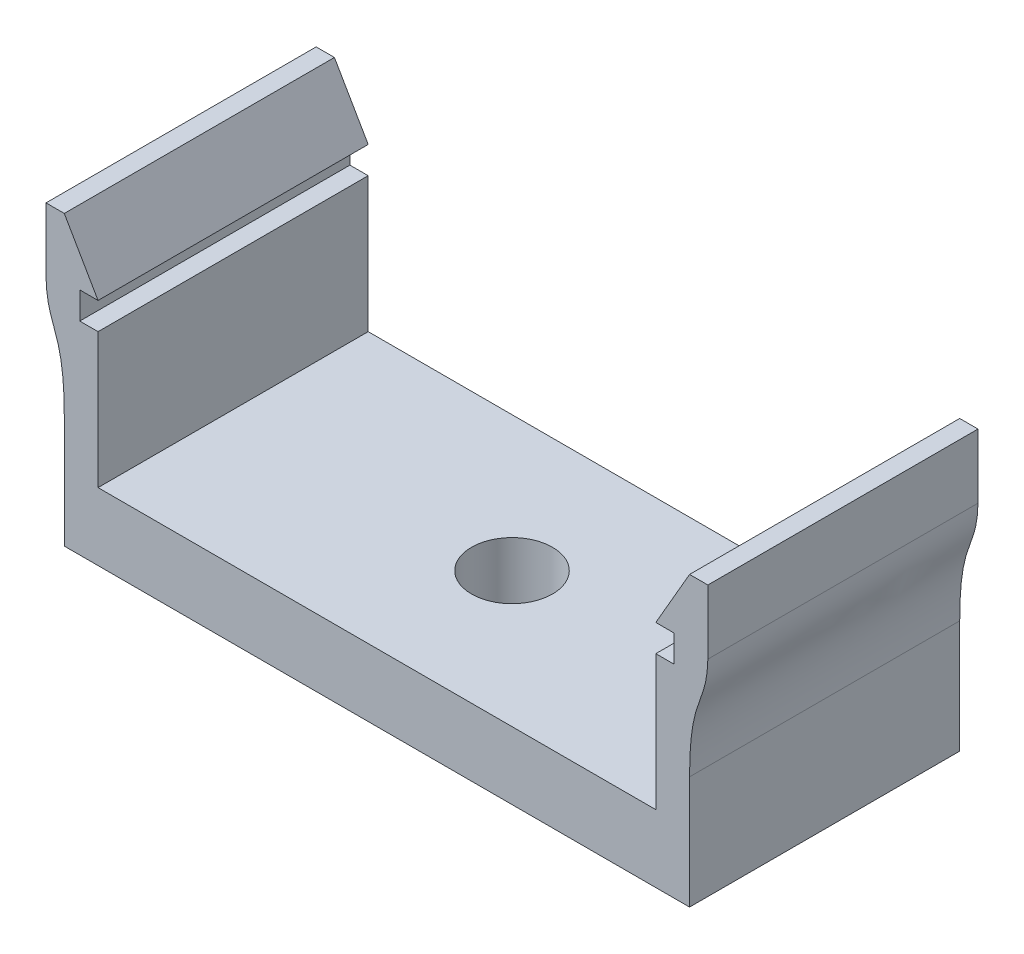
ISO-10303-21;
HEADER;
FILE_DESCRIPTION(('STEP AP214'),'2;1');
FILE_NAME('part.step','',(''),(''),'','','');
FILE_SCHEMA(('AUTOMOTIVE_DESIGN { 1 0 10303 214 1 1 1 1 }'));
ENDSEC;
DATA;
#1=APPLICATION_CONTEXT('core data for automotive mechanical design processes');
#2=APPLICATION_PROTOCOL_DEFINITION('international standard','automotive_design',2000,#1);
#3=PRODUCT_CONTEXT('',#1,'mechanical');
#4=PRODUCT('Part','Part','',(#3));
#5=PRODUCT_RELATED_PRODUCT_CATEGORY('part','',(#4));
#6=PRODUCT_DEFINITION_FORMATION('','',#4);
#7=PRODUCT_DEFINITION_CONTEXT('part definition',#1,'design');
#8=PRODUCT_DEFINITION('design','',#6,#7);
#9=PRODUCT_DEFINITION_SHAPE('','',#8);
#10=(LENGTH_UNIT() NAMED_UNIT(*) SI_UNIT(.MILLI.,.METRE.));
#11=(NAMED_UNIT(*) PLANE_ANGLE_UNIT() SI_UNIT($,.RADIAN.));
#12=(NAMED_UNIT(*) SI_UNIT($,.STERADIAN.) SOLID_ANGLE_UNIT());
#13=UNCERTAINTY_MEASURE_WITH_UNIT(LENGTH_MEASURE(1.E-05),#10,'distance_accuracy_value','');
#14=(GEOMETRIC_REPRESENTATION_CONTEXT(3) GLOBAL_UNCERTAINTY_ASSIGNED_CONTEXT((#13)) GLOBAL_UNIT_ASSIGNED_CONTEXT((#10,
#11,#12)) REPRESENTATION_CONTEXT('',''));
#15=CARTESIAN_POINT('',(0.,0.,0.));
#16=DIRECTION('',(0.,0.,1.));
#17=DIRECTION('',(1.,0.,0.));
#18=AXIS2_PLACEMENT_3D('',#15,#16,#17);
#19=CARTESIAN_POINT('',(-14.6977804438465,0.,12.7));
#20=DIRECTION('',(0.,1.,0.));
#21=DIRECTION('',(0.,0.,1.));
#22=AXIS2_PLACEMENT_3D('',#19,#20,#21);
#23=PLANE('',#22);
#24=CARTESIAN_POINT('',(0.,0.,6.35));
#25=DIRECTION('',(0.,1.,0.));
#26=DIRECTION('',(0.,0.,1.));
#27=AXIS2_PLACEMENT_3D('',#24,#25,#26);
#28=CIRCLE('',#27,1.905);
#29=CARTESIAN_POINT('',(0.,0.,8.255));
#30=VERTEX_POINT('',#29);
#31=EDGE_CURVE('E313',#30,#30,#28,.T.);
#32=ORIENTED_EDGE('',*,*,#31,.T.);
#33=EDGE_LOOP('',(#32));
#34=FACE_BOUND('',#33,.T.);
#35=DIRECTION('',(1.,0.,0.));
#36=VECTOR('',#35,1.);
#37=CARTESIAN_POINT('',(-14.6977804438465,0.,0.));
#38=LINE('',#37,#36);
#39=CARTESIAN_POINT('',(-14.6977804438465,0.,0.));
#40=VERTEX_POINT('',#39);
#41=CARTESIAN_POINT('',(14.6977804438465,0.,0.));
#42=VERTEX_POINT('',#41);
#43=EDGE_CURVE('E213',#40,#42,#38,.T.);
#44=ORIENTED_EDGE('',*,*,#43,.T.);
#45=DIRECTION('',(0.,0.,-1.));
#46=VECTOR('',#45,1.);
#47=CARTESIAN_POINT('',(14.6977804438465,0.,12.7));
#48=LINE('',#47,#46);
#49=CARTESIAN_POINT('',(14.6977804438465,0.,12.7));
#50=VERTEX_POINT('',#49);
#51=EDGE_CURVE('E285',#50,#42,#48,.T.);
#52=ORIENTED_EDGE('',*,*,#51,.F.);
#53=DIRECTION('',(1.,0.,0.));
#54=VECTOR('',#53,1.);
#55=CARTESIAN_POINT('',(-14.6977804438465,0.,12.7));
#56=LINE('',#55,#54);
#57=CARTESIAN_POINT('',(-14.6977804438465,0.,12.7));
#58=VERTEX_POINT('',#57);
#59=EDGE_CURVE('E242',#58,#50,#56,.T.);
#60=ORIENTED_EDGE('',*,*,#59,.F.);
#61=DIRECTION('',(0.,0.,-1.));
#62=VECTOR('',#61,1.);
#63=CARTESIAN_POINT('',(-14.6977804438465,0.,12.7));
#64=LINE('',#63,#62);
#65=EDGE_CURVE('E150',#58,#40,#64,.T.);
#66=ORIENTED_EDGE('',*,*,#65,.T.);
#67=EDGE_LOOP('',(#44,#52,#60,#66));
#68=FACE_BOUND('',#67,.T.);
#69=ADVANCED_FACE('F41',(#34,#68),#23,.F.);
#70=CARTESIAN_POINT('',(0.,3.175,12.7));
#71=DIRECTION('',(0.,-1.,0.));
#72=DIRECTION('',(0.,0.,-1.));
#73=AXIS2_PLACEMENT_3D('',#70,#71,#72);
#74=PLANE('',#73);
#75=CARTESIAN_POINT('',(0.,3.175,6.35));
#76=DIRECTION('',(0.,1.,0.));
#77=DIRECTION('',(0.,0.,1.));
#78=AXIS2_PLACEMENT_3D('',#75,#76,#77);
#79=CIRCLE('',#78,1.905);
#80=CARTESIAN_POINT('',(0.,3.175,8.255));
#81=VERTEX_POINT('',#80);
#82=EDGE_CURVE('E201',#81,#81,#79,.T.);
#83=ORIENTED_EDGE('',*,*,#82,.F.);
#84=EDGE_LOOP('',(#83));
#85=FACE_BOUND('',#84,.T.);
#86=DIRECTION('',(-1.,0.,0.));
#87=VECTOR('',#86,1.);
#88=CARTESIAN_POINT('',(0.,3.175,0.));
#89=LINE('',#88,#87);
#90=CARTESIAN_POINT('',(13.1102804438465,3.175,0.));
#91=VERTEX_POINT('',#90);
#92=CARTESIAN_POINT('',(-13.1102804438465,3.175,0.));
#93=VERTEX_POINT('',#92);
#94=EDGE_CURVE('E204',#91,#93,#89,.T.);
#95=ORIENTED_EDGE('',*,*,#94,.T.);
#96=DIRECTION('',(0.,0.,-1.));
#97=VECTOR('',#96,1.);
#98=CARTESIAN_POINT('',(-13.1102804438465,3.175,12.7));
#99=LINE('',#98,#97);
#100=CARTESIAN_POINT('',(-13.1102804438465,3.175,12.7));
#101=VERTEX_POINT('',#100);
#102=EDGE_CURVE('E11',#101,#93,#99,.T.);
#103=ORIENTED_EDGE('',*,*,#102,.F.);
#104=DIRECTION('',(-1.,0.,0.));
#105=VECTOR('',#104,1.);
#106=CARTESIAN_POINT('',(0.,3.175,12.7));
#107=LINE('',#106,#105);
#108=CARTESIAN_POINT('',(13.1102804438465,3.175,12.7));
#109=VERTEX_POINT('',#108);
#110=EDGE_CURVE('E107',#109,#101,#107,.T.);
#111=ORIENTED_EDGE('',*,*,#110,.F.);
#112=DIRECTION('',(0.,0.,-1.));
#113=VECTOR('',#112,1.);
#114=CARTESIAN_POINT('',(13.1102804438465,3.175,12.7));
#115=LINE('',#114,#113);
#116=EDGE_CURVE('E207',#109,#91,#115,.T.);
#117=ORIENTED_EDGE('',*,*,#116,.T.);
#118=EDGE_LOOP('',(#95,#103,#111,#117));
#119=FACE_BOUND('',#118,.T.);
#120=ADVANCED_FACE('F190',(#85,#119),#74,.F.);
#121=CARTESIAN_POINT('',(-13.1102804438465,3.175,12.7));
#122=DIRECTION('',(-1.,0.,0.));
#123=DIRECTION('',(0.,-1.,0.));
#124=AXIS2_PLACEMENT_3D('',#121,#122,#123);
#125=PLANE('',#124);
#126=DIRECTION('',(0.,1.,0.));
#127=VECTOR('',#126,1.);
#128=CARTESIAN_POINT('',(-13.1102804438465,3.175,0.));
#129=LINE('',#128,#127);
#130=CARTESIAN_POINT('',(-13.1102804438465,9.525,0.));
#131=VERTEX_POINT('',#130);
#132=EDGE_CURVE('E212',#93,#131,#129,.T.);
#133=ORIENTED_EDGE('',*,*,#132,.T.);
#134=DIRECTION('',(0.,0.,-1.));
#135=VECTOR('',#134,1.);
#136=CARTESIAN_POINT('',(-13.1102804438465,9.525,12.7));
#137=LINE('',#136,#135);
#138=CARTESIAN_POINT('',(-13.1102804438465,9.525,12.7));
#139=VERTEX_POINT('',#138);
#140=EDGE_CURVE('E49',#139,#131,#137,.T.);
#141=ORIENTED_EDGE('',*,*,#140,.F.);
#142=DIRECTION('',(0.,1.,0.));
#143=VECTOR('',#142,1.);
#144=CARTESIAN_POINT('',(-13.1102804438465,3.175,12.7));
#145=LINE('',#144,#143);
#146=EDGE_CURVE('E217',#101,#139,#145,.T.);
#147=ORIENTED_EDGE('',*,*,#146,.F.);
#148=ORIENTED_EDGE('',*,*,#102,.T.);
#149=EDGE_LOOP('',(#133,#141,#147,#148));
#150=FACE_BOUND('',#149,.T.);
#151=ADVANCED_FACE('F187',(#150),#125,.F.);
#152=CARTESIAN_POINT('',(-13.1102804438465,9.525,12.7));
#153=DIRECTION('',(0.,-1.,0.));
#154=DIRECTION('',(0.,0.,-1.));
#155=AXIS2_PLACEMENT_3D('',#152,#153,#154);
#156=PLANE('',#155);
#157=DIRECTION('',(-1.,0.,0.));
#158=VECTOR('',#157,1.);
#159=CARTESIAN_POINT('',(-13.1102804438465,9.525,0.));
#160=LINE('',#159,#158);
#161=CARTESIAN_POINT('',(-13.97,9.525,0.));
#162=VERTEX_POINT('',#161);
#163=EDGE_CURVE('E222',#131,#162,#160,.T.);
#164=ORIENTED_EDGE('',*,*,#163,.T.);
#165=DIRECTION('',(0.,0.,-1.));
#166=VECTOR('',#165,1.);
#167=CARTESIAN_POINT('',(-13.97,9.525,12.7));
#168=LINE('',#167,#166);
#169=CARTESIAN_POINT('',(-13.97,9.525,12.7));
#170=VERTEX_POINT('',#169);
#171=EDGE_CURVE('E255',#170,#162,#168,.T.);
#172=ORIENTED_EDGE('',*,*,#171,.F.);
#173=DIRECTION('',(-1.,0.,0.));
#174=VECTOR('',#173,1.);
#175=CARTESIAN_POINT('',(-13.1102804438465,9.525,12.7));
#176=LINE('',#175,#174);
#177=EDGE_CURVE('E259',#139,#170,#176,.T.);
#178=ORIENTED_EDGE('',*,*,#177,.F.);
#179=ORIENTED_EDGE('',*,*,#140,.T.);
#180=EDGE_LOOP('',(#164,#172,#178,#179));
#181=FACE_BOUND('',#180,.T.);
#182=ADVANCED_FACE('F183',(#181),#156,.F.);
#183=CARTESIAN_POINT('',(-13.97,9.525,12.7));
#184=DIRECTION('',(-1.,0.,0.));
#185=DIRECTION('',(0.,0.,1.));
#186=AXIS2_PLACEMENT_3D('',#183,#184,#185);
#187=PLANE('',#186);
#188=DIRECTION('',(0.,1.,0.));
#189=VECTOR('',#188,1.);
#190=CARTESIAN_POINT('',(-13.97,9.525,0.));
#191=LINE('',#190,#189);
#192=CARTESIAN_POINT('',(-13.97,10.795,0.));
#193=VERTEX_POINT('',#192);
#194=EDGE_CURVE('E224',#162,#193,#191,.T.);
#195=ORIENTED_EDGE('',*,*,#194,.T.);
#196=DIRECTION('',(0.,0.,-1.));
#197=VECTOR('',#196,1.);
#198=CARTESIAN_POINT('',(-13.97,10.795,12.7));
#199=LINE('',#198,#197);
#200=CARTESIAN_POINT('',(-13.97,10.795,12.7));
#201=VERTEX_POINT('',#200);
#202=EDGE_CURVE('E252',#201,#193,#199,.T.);
#203=ORIENTED_EDGE('',*,*,#202,.F.);
#204=DIRECTION('',(0.,1.,0.));
#205=VECTOR('',#204,1.);
#206=CARTESIAN_POINT('',(-13.97,9.525,12.7));
#207=LINE('',#206,#205);
#208=EDGE_CURVE('E261',#170,#201,#207,.T.);
#209=ORIENTED_EDGE('',*,*,#208,.F.);
#210=ORIENTED_EDGE('',*,*,#171,.T.);
#211=EDGE_LOOP('',(#195,#203,#209,#210));
#212=FACE_BOUND('',#211,.T.);
#213=ADVANCED_FACE('F179',(#212),#187,.F.);
#214=CARTESIAN_POINT('',(-13.97,10.795,12.7));
#215=DIRECTION('',(0.,1.,0.));
#216=DIRECTION('',(0.,0.,1.));
#217=AXIS2_PLACEMENT_3D('',#214,#215,#216);
#218=PLANE('',#217);
#219=DIRECTION('',(1.,0.,0.));
#220=VECTOR('',#219,1.);
#221=CARTESIAN_POINT('',(-13.97,10.795,0.));
#222=LINE('',#221,#220);
#223=CARTESIAN_POINT('',(-13.1102804438465,10.795,0.));
#224=VERTEX_POINT('',#223);
#225=EDGE_CURVE('E228',#193,#224,#222,.T.);
#226=ORIENTED_EDGE('',*,*,#225,.T.);
#227=DIRECTION('',(0.,0.,-1.));
#228=VECTOR('',#227,1.);
#229=CARTESIAN_POINT('',(-13.1102804438465,10.795,12.7));
#230=LINE('',#229,#228);
#231=CARTESIAN_POINT('',(-13.1102804438465,10.795,12.7));
#232=VERTEX_POINT('',#231);
#233=EDGE_CURVE('E249',#232,#224,#230,.T.);
#234=ORIENTED_EDGE('',*,*,#233,.F.);
#235=DIRECTION('',(1.,0.,0.));
#236=VECTOR('',#235,1.);
#237=CARTESIAN_POINT('',(-13.97,10.795,12.7));
#238=LINE('',#237,#236);
#239=EDGE_CURVE('E263',#201,#232,#238,.T.);
#240=ORIENTED_EDGE('',*,*,#239,.F.);
#241=ORIENTED_EDGE('',*,*,#202,.T.);
#242=EDGE_LOOP('',(#226,#234,#240,#241));
#243=FACE_BOUND('',#242,.T.);
#244=ADVANCED_FACE('F175',(#243),#218,.F.);
#245=CARTESIAN_POINT('',(-13.1102804438465,10.795,12.7));
#246=DIRECTION('',(-0.866025403784436,-0.500000000000005,0.));
#247=DIRECTION('',(0.500000000000005,-0.866025403784436,0.));
#248=AXIS2_PLACEMENT_3D('',#245,#246,#247);
#249=PLANE('',#248);
#250=DIRECTION('',(-0.500000000000005,0.866025403784436,0.));
#251=VECTOR('',#250,1.);
#252=CARTESIAN_POINT('',(-13.1102804438465,10.795,0.));
#253=LINE('',#252,#251);
#254=CARTESIAN_POINT('',(-14.6977804438465,13.5446306570156,0.));
#255=VERTEX_POINT('',#254);
#256=EDGE_CURVE('E230',#224,#255,#253,.T.);
#257=ORIENTED_EDGE('',*,*,#256,.T.);
#258=DIRECTION('',(0.,0.,-1.));
#259=VECTOR('',#258,1.);
#260=CARTESIAN_POINT('',(-14.6977804438465,13.5446306570156,12.7));
#261=LINE('',#260,#259);
#262=CARTESIAN_POINT('',(-14.6977804438465,13.5446306570156,12.7));
#263=VERTEX_POINT('',#262);
#264=EDGE_CURVE('E246',#263,#255,#261,.T.);
#265=ORIENTED_EDGE('',*,*,#264,.F.);
#266=DIRECTION('',(-0.500000000000005,0.866025403784436,0.));
#267=VECTOR('',#266,1.);
#268=CARTESIAN_POINT('',(-13.1102804438465,10.795,12.7));
#269=LINE('',#268,#267);
#270=EDGE_CURVE('E269',#232,#263,#269,.T.);
#271=ORIENTED_EDGE('',*,*,#270,.F.);
#272=ORIENTED_EDGE('',*,*,#233,.T.);
#273=EDGE_LOOP('',(#257,#265,#271,#272));
#274=FACE_BOUND('',#273,.T.);
#275=ADVANCED_FACE('F171',(#274),#249,.F.);
#276=CARTESIAN_POINT('',(-15.5575,13.5446306570156,12.7));
#277=DIRECTION('',(0.,-1.,0.));
#278=DIRECTION('',(0.,0.,-1.));
#279=AXIS2_PLACEMENT_3D('',#276,#277,#278);
#280=PLANE('',#279);
#281=DIRECTION('',(-1.,0.,0.));
#282=VECTOR('',#281,1.);
#283=CARTESIAN_POINT('',(-15.5575,13.5446306570156,0.));
#284=LINE('',#283,#282);
#285=CARTESIAN_POINT('',(-15.5575,13.5446306570156,0.));
#286=VERTEX_POINT('',#285);
#287=EDGE_CURVE('E232',#255,#286,#284,.T.);
#288=ORIENTED_EDGE('',*,*,#287,.T.);
#289=DIRECTION('',(0.,0.,-1.));
#290=VECTOR('',#289,1.);
#291=CARTESIAN_POINT('',(-15.5575,13.5446306570156,12.7));
#292=LINE('',#291,#290);
#293=CARTESIAN_POINT('',(-15.5575,13.5446306570156,12.7));
#294=VERTEX_POINT('',#293);
#295=EDGE_CURVE('E145',#294,#286,#292,.T.);
#296=ORIENTED_EDGE('',*,*,#295,.F.);
#297=DIRECTION('',(-1.,0.,0.));
#298=VECTOR('',#297,1.);
#299=CARTESIAN_POINT('',(-15.5575,13.5446306570156,12.7));
#300=LINE('',#299,#298);
#301=EDGE_CURVE('E136',#263,#294,#300,.T.);
#302=ORIENTED_EDGE('',*,*,#301,.F.);
#303=ORIENTED_EDGE('',*,*,#264,.T.);
#304=EDGE_LOOP('',(#288,#296,#302,#303));
#305=FACE_BOUND('',#304,.T.);
#306=ADVANCED_FACE('F168',(#305),#280,.F.);
#307=CARTESIAN_POINT('',(-15.5575,10.5249423020982,12.7));
#308=DIRECTION('',(1.,0.,0.));
#309=DIRECTION('',(0.,0.,-1.));
#310=AXIS2_PLACEMENT_3D('',#307,#308,#309);
#311=PLANE('',#310);
#312=DIRECTION('',(0.,-1.,0.));
#313=VECTOR('',#312,1.);
#314=CARTESIAN_POINT('',(-15.5575,10.5249423020982,0.));
#315=LINE('',#314,#313);
#316=CARTESIAN_POINT('',(-15.5575,10.5249423020982,0.));
#317=VERTEX_POINT('',#316);
#318=EDGE_CURVE('E144',#286,#317,#315,.T.);
#319=ORIENTED_EDGE('',*,*,#318,.T.);
#320=DIRECTION('',(0.,0.,-1.));
#321=VECTOR('',#320,1.);
#322=CARTESIAN_POINT('',(-15.5575,10.5249423020982,12.7));
#323=LINE('',#322,#321);
#324=CARTESIAN_POINT('',(-15.5575,10.5249423020982,12.7));
#325=VERTEX_POINT('',#324);
#326=EDGE_CURVE('E141',#325,#317,#323,.T.);
#327=ORIENTED_EDGE('',*,*,#326,.F.);
#328=DIRECTION('',(0.,-1.,0.));
#329=VECTOR('',#328,1.);
#330=CARTESIAN_POINT('',(-15.5575,10.5249423020982,12.7));
#331=LINE('',#330,#329);
#332=EDGE_CURVE('E130',#294,#325,#331,.T.);
#333=ORIENTED_EDGE('',*,*,#332,.F.);
#334=ORIENTED_EDGE('',*,*,#295,.T.);
#335=EDGE_LOOP('',(#319,#327,#333,#334));
#336=FACE_BOUND('',#335,.T.);
#337=ADVANCED_FACE('F142',(#336),#311,.F.);
#338=CARTESIAN_POINT('',(-15.5575,10.5249423020982,12.7));
#339=CARTESIAN_POINT('',(-15.5018719829837,8.43607098462699,12.7));
#340=CARTESIAN_POINT('',(-14.6977804438465,8.85975671238706,12.7));
#341=CARTESIAN_POINT('',(-14.6977804438465,5.30409890052551,12.7));
#342=B_SPLINE_CURVE_WITH_KNOTS('',3,(#338,#339,#340,#341),.UNSPECIFIED.,.F.,.F.,(4,4),(0.,1.),.UNSPECIFIED.);
#343=DIRECTION('',(0.,0.,-1.));
#344=VECTOR('',#343,1.);
#345=SURFACE_OF_LINEAR_EXTRUSION('',#342,#344);
#346=CARTESIAN_POINT('',(-15.5575,10.5249423020982,0.));
#347=CARTESIAN_POINT('',(-15.5018719829837,8.43607098462699,0.));
#348=CARTESIAN_POINT('',(-14.6977804438465,8.85975671238706,0.));
#349=CARTESIAN_POINT('',(-14.6977804438465,5.30409890052551,0.));
#350=B_SPLINE_CURVE_WITH_KNOTS('',3,(#346,#347,#348,#349),.UNSPECIFIED.,.F.,.F.,(4,4),(0.,1.),.UNSPECIFIED.);
#351=CARTESIAN_POINT('',(-14.6977804438465,5.30409890052551,0.));
#352=VERTEX_POINT('',#351);
#353=EDGE_CURVE('E93',#317,#352,#350,.T.);
#354=ORIENTED_EDGE('',*,*,#353,.T.);
#355=DIRECTION('',(0.,0.,-1.));
#356=VECTOR('',#355,1.);
#357=CARTESIAN_POINT('',(-14.6977804438465,5.30409890052551,12.7));
#358=LINE('',#357,#356);
#359=CARTESIAN_POINT('',(-14.6977804438465,5.30409890052551,12.7));
#360=VERTEX_POINT('',#359);
#361=EDGE_CURVE('E146',#360,#352,#358,.T.);
#362=ORIENTED_EDGE('',*,*,#361,.F.);
#363=EDGE_CURVE('E134',#325,#360,#342,.T.);
#364=ORIENTED_EDGE('',*,*,#363,.F.);
#365=ORIENTED_EDGE('',*,*,#326,.T.);
#366=EDGE_LOOP('',(#354,#362,#364,#365));
#367=FACE_BOUND('',#366,.T.);
#368=ADVANCED_FACE('F148',(#367),#345,.F.);
#369=CARTESIAN_POINT('',(-14.6977804438465,0.,12.7));
#370=DIRECTION('',(1.,0.,0.));
#371=DIRECTION('',(0.,0.,-1.));
#372=AXIS2_PLACEMENT_3D('',#369,#370,#371);
#373=PLANE('',#372);
#374=DIRECTION('',(0.,-1.,0.));
#375=VECTOR('',#374,1.);
#376=CARTESIAN_POINT('',(-14.6977804438465,0.,0.));
#377=LINE('',#376,#375);
#378=EDGE_CURVE('E99',#352,#40,#377,.T.);
#379=ORIENTED_EDGE('',*,*,#378,.T.);
#380=ORIENTED_EDGE('',*,*,#65,.F.);
#381=DIRECTION('',(0.,-1.,0.));
#382=VECTOR('',#381,1.);
#383=CARTESIAN_POINT('',(-14.6977804438465,0.,12.7));
#384=LINE('',#383,#382);
#385=EDGE_CURVE('E57',#360,#58,#384,.T.);
#386=ORIENTED_EDGE('',*,*,#385,.F.);
#387=ORIENTED_EDGE('',*,*,#361,.T.);
#388=EDGE_LOOP('',(#379,#380,#386,#387));
#389=FACE_BOUND('',#388,.T.);
#390=ADVANCED_FACE('F164',(#389),#373,.F.);
#391=CARTESIAN_POINT('',(-15.1067797155421,8.46456553670823,12.7));
#392=DIRECTION('',(0.,0.,-1.));
#393=DIRECTION('',(-1.,0.,0.));
#394=AXIS2_PLACEMENT_3D('',#391,#392,#393);
#395=PLANE('',#394);
#396=ORIENTED_EDGE('',*,*,#59,.T.);
#397=DIRECTION('',(0.,-1.,0.));
#398=VECTOR('',#397,1.);
#399=CARTESIAN_POINT('',(14.6977804438465,0.,12.7));
#400=LINE('',#399,#398);
#401=CARTESIAN_POINT('',(14.6977804438465,5.30409890052551,12.7));
#402=VERTEX_POINT('',#401);
#403=EDGE_CURVE('E300',#402,#50,#400,.T.);
#404=ORIENTED_EDGE('',*,*,#403,.F.);
#405=CARTESIAN_POINT('',(15.5575,10.5249423020982,12.7));
#406=CARTESIAN_POINT('',(15.5018719829837,8.43607098462699,12.7));
#407=CARTESIAN_POINT('',(14.6977804438465,8.85975671238706,12.7));
#408=CARTESIAN_POINT('',(14.6977804438465,5.30409890052551,12.7));
#409=B_SPLINE_CURVE_WITH_KNOTS('',3,(#405,#406,#407,#408),.UNSPECIFIED.,.F.,.F.,(4,4),(0.,1.),.UNSPECIFIED.);
#410=CARTESIAN_POINT('',(15.5575,10.5249423020982,12.7));
#411=VERTEX_POINT('',#410);
#412=EDGE_CURVE('E305',#411,#402,#409,.T.);
#413=ORIENTED_EDGE('',*,*,#412,.F.);
#414=DIRECTION('',(0.,-1.,0.));
#415=VECTOR('',#414,1.);
#416=CARTESIAN_POINT('',(15.5575,10.5249423020982,12.7));
#417=LINE('',#416,#415);
#418=CARTESIAN_POINT('',(15.5575,13.5446306570156,12.7));
#419=VERTEX_POINT('',#418);
#420=EDGE_CURVE('E308',#419,#411,#417,.T.);
#421=ORIENTED_EDGE('',*,*,#420,.F.);
#422=DIRECTION('',(1.,0.,0.));
#423=VECTOR('',#422,1.);
#424=CARTESIAN_POINT('',(15.5575,13.5446306570156,12.7));
#425=LINE('',#424,#423);
#426=CARTESIAN_POINT('',(14.6977804438465,13.5446306570156,12.7));
#427=VERTEX_POINT('',#426);
#428=EDGE_CURVE('E661',#427,#419,#425,.T.);
#429=ORIENTED_EDGE('',*,*,#428,.F.);
#430=DIRECTION('',(0.500000000000005,0.866025403784436,0.));
#431=VECTOR('',#430,1.);
#432=CARTESIAN_POINT('',(13.1102804438465,10.795,12.7));
#433=LINE('',#432,#431);
#434=CARTESIAN_POINT('',(13.1102804438465,10.795,12.7));
#435=VERTEX_POINT('',#434);
#436=EDGE_CURVE('E659',#435,#427,#433,.T.);
#437=ORIENTED_EDGE('',*,*,#436,.F.);
#438=DIRECTION('',(-1.,0.,0.));
#439=VECTOR('',#438,1.);
#440=CARTESIAN_POINT('',(13.97,10.795,12.7));
#441=LINE('',#440,#439);
#442=CARTESIAN_POINT('',(13.97,10.795,12.7));
#443=VERTEX_POINT('',#442);
#444=EDGE_CURVE('E657',#443,#435,#441,.T.);
#445=ORIENTED_EDGE('',*,*,#444,.F.);
#446=DIRECTION('',(0.,1.,0.));
#447=VECTOR('',#446,1.);
#448=CARTESIAN_POINT('',(13.97,9.525,12.7));
#449=LINE('',#448,#447);
#450=CARTESIAN_POINT('',(13.97,9.525,12.7));
#451=VERTEX_POINT('',#450);
#452=EDGE_CURVE('E652',#451,#443,#449,.T.);
#453=ORIENTED_EDGE('',*,*,#452,.F.);
#454=DIRECTION('',(1.,0.,0.));
#455=VECTOR('',#454,1.);
#456=CARTESIAN_POINT('',(13.1102804438465,9.525,12.7));
#457=LINE('',#456,#455);
#458=CARTESIAN_POINT('',(13.1102804438465,9.525,12.7));
#459=VERTEX_POINT('',#458);
#460=EDGE_CURVE('E665',#459,#451,#457,.T.);
#461=ORIENTED_EDGE('',*,*,#460,.F.);
#462=DIRECTION('',(0.,1.,0.));
#463=VECTOR('',#462,1.);
#464=CARTESIAN_POINT('',(13.1102804438465,3.175,12.7));
#465=LINE('',#464,#463);
#466=EDGE_CURVE('E567',#109,#459,#465,.T.);
#467=ORIENTED_EDGE('',*,*,#466,.F.);
#468=ORIENTED_EDGE('',*,*,#110,.T.);
#469=ORIENTED_EDGE('',*,*,#146,.T.);
#470=ORIENTED_EDGE('',*,*,#177,.T.);
#471=ORIENTED_EDGE('',*,*,#208,.T.);
#472=ORIENTED_EDGE('',*,*,#239,.T.);
#473=ORIENTED_EDGE('',*,*,#270,.T.);
#474=ORIENTED_EDGE('',*,*,#301,.T.);
#475=ORIENTED_EDGE('',*,*,#332,.T.);
#476=ORIENTED_EDGE('',*,*,#363,.T.);
#477=ORIENTED_EDGE('',*,*,#385,.T.);
#478=EDGE_LOOP('',(#396,#404,#413,#421,#429,#437,#445,#453,#461,#467,#468,#469,#470,#471,#472,
#473,#474,#475,#476,#477));
#479=FACE_BOUND('',#478,.T.);
#480=ADVANCED_FACE('F132',(#479),#395,.F.);
#481=CARTESIAN_POINT('',(-15.1067797155421,8.46456553670823,0.));
#482=DIRECTION('',(0.,0.,-1.));
#483=DIRECTION('',(-1.,0.,0.));
#484=AXIS2_PLACEMENT_3D('',#481,#482,#483);
#485=PLANE('',#484);
#486=ORIENTED_EDGE('',*,*,#43,.F.);
#487=ORIENTED_EDGE('',*,*,#378,.F.);
#488=ORIENTED_EDGE('',*,*,#353,.F.);
#489=ORIENTED_EDGE('',*,*,#318,.F.);
#490=ORIENTED_EDGE('',*,*,#287,.F.);
#491=ORIENTED_EDGE('',*,*,#256,.F.);
#492=ORIENTED_EDGE('',*,*,#225,.F.);
#493=ORIENTED_EDGE('',*,*,#194,.F.);
#494=ORIENTED_EDGE('',*,*,#163,.F.);
#495=ORIENTED_EDGE('',*,*,#132,.F.);
#496=ORIENTED_EDGE('',*,*,#94,.F.);
#497=DIRECTION('',(0.,1.,0.));
#498=VECTOR('',#497,1.);
#499=CARTESIAN_POINT('',(13.1102804438465,3.175,0.));
#500=LINE('',#499,#498);
#501=CARTESIAN_POINT('',(13.1102804438465,9.525,0.));
#502=VERTEX_POINT('',#501);
#503=EDGE_CURVE('E306',#91,#502,#500,.T.);
#504=ORIENTED_EDGE('',*,*,#503,.T.);
#505=DIRECTION('',(1.,0.,0.));
#506=VECTOR('',#505,1.);
#507=CARTESIAN_POINT('',(13.1102804438465,9.525,0.));
#508=LINE('',#507,#506);
#509=CARTESIAN_POINT('',(13.97,9.525,0.));
#510=VERTEX_POINT('',#509);
#511=EDGE_CURVE('E310',#502,#510,#508,.T.);
#512=ORIENTED_EDGE('',*,*,#511,.T.);
#513=DIRECTION('',(0.,1.,0.));
#514=VECTOR('',#513,1.);
#515=CARTESIAN_POINT('',(13.97,9.525,0.));
#516=LINE('',#515,#514);
#517=CARTESIAN_POINT('',(13.97,10.795,0.));
#518=VERTEX_POINT('',#517);
#519=EDGE_CURVE('E586',#510,#518,#516,.T.);
#520=ORIENTED_EDGE('',*,*,#519,.T.);
#521=DIRECTION('',(-1.,0.,0.));
#522=VECTOR('',#521,1.);
#523=CARTESIAN_POINT('',(13.97,10.795,0.));
#524=LINE('',#523,#522);
#525=CARTESIAN_POINT('',(13.1102804438465,10.795,0.));
#526=VERTEX_POINT('',#525);
#527=EDGE_CURVE('E583',#518,#526,#524,.T.);
#528=ORIENTED_EDGE('',*,*,#527,.T.);
#529=DIRECTION('',(0.500000000000005,0.866025403784436,0.));
#530=VECTOR('',#529,1.);
#531=CARTESIAN_POINT('',(13.1102804438465,10.795,0.));
#532=LINE('',#531,#530);
#533=CARTESIAN_POINT('',(14.6977804438465,13.5446306570156,0.));
#534=VERTEX_POINT('',#533);
#535=EDGE_CURVE('E580',#526,#534,#532,.T.);
#536=ORIENTED_EDGE('',*,*,#535,.T.);
#537=DIRECTION('',(1.,0.,0.));
#538=VECTOR('',#537,1.);
#539=CARTESIAN_POINT('',(15.5575,13.5446306570156,0.));
#540=LINE('',#539,#538);
#541=CARTESIAN_POINT('',(15.5575,13.5446306570156,0.));
#542=VERTEX_POINT('',#541);
#543=EDGE_CURVE('E577',#534,#542,#540,.T.);
#544=ORIENTED_EDGE('',*,*,#543,.T.);
#545=DIRECTION('',(0.,-1.,0.));
#546=VECTOR('',#545,1.);
#547=CARTESIAN_POINT('',(15.5575,10.5249423020982,0.));
#548=LINE('',#547,#546);
#549=CARTESIAN_POINT('',(15.5575,10.5249423020982,0.));
#550=VERTEX_POINT('',#549);
#551=EDGE_CURVE('E564',#542,#550,#548,.T.);
#552=ORIENTED_EDGE('',*,*,#551,.T.);
#553=CARTESIAN_POINT('',(15.5575,10.5249423020982,0.));
#554=CARTESIAN_POINT('',(15.5018719829837,8.43607098462699,0.));
#555=CARTESIAN_POINT('',(14.6977804438465,8.85975671238706,0.));
#556=CARTESIAN_POINT('',(14.6977804438465,5.30409890052551,0.));
#557=B_SPLINE_CURVE_WITH_KNOTS('',3,(#553,#554,#555,#556),.UNSPECIFIED.,.F.,.F.,(4,4),(0.,1.),.UNSPECIFIED.);
#558=CARTESIAN_POINT('',(14.6977804438465,5.30409890052551,0.));
#559=VERTEX_POINT('',#558);
#560=EDGE_CURVE('E562',#550,#559,#557,.T.);
#561=ORIENTED_EDGE('',*,*,#560,.T.);
#562=DIRECTION('',(0.,-1.,0.));
#563=VECTOR('',#562,1.);
#564=CARTESIAN_POINT('',(14.6977804438465,0.,0.));
#565=LINE('',#564,#563);
#566=EDGE_CURVE('E281',#559,#42,#565,.T.);
#567=ORIENTED_EDGE('',*,*,#566,.T.);
#568=EDGE_LOOP('',(#486,#487,#488,#489,#490,#491,#492,#493,#494,#495,#496,#504,#512,#520,#528,
#536,#544,#552,#561,#567));
#569=FACE_BOUND('',#568,.T.);
#570=ADVANCED_FACE('F220',(#569),#485,.T.);
#571=CARTESIAN_POINT('',(14.6977804438465,0.,12.7));
#572=DIRECTION('',(1.,0.,0.));
#573=DIRECTION('',(0.,0.,-1.));
#574=AXIS2_PLACEMENT_3D('',#571,#572,#573);
#575=PLANE('',#574);
#576=ORIENTED_EDGE('',*,*,#566,.F.);
#577=DIRECTION('',(0.,0.,-1.));
#578=VECTOR('',#577,1.);
#579=CARTESIAN_POINT('',(14.6977804438465,5.30409890052551,12.7));
#580=LINE('',#579,#578);
#581=EDGE_CURVE('E286',#402,#559,#580,.T.);
#582=ORIENTED_EDGE('',*,*,#581,.F.);
#583=ORIENTED_EDGE('',*,*,#403,.T.);
#584=ORIENTED_EDGE('',*,*,#51,.T.);
#585=EDGE_LOOP('',(#576,#582,#583,#584));
#586=FACE_BOUND('',#585,.T.);
#587=ADVANCED_FACE('F304',(#586),#575,.T.);
#588=DIRECTION('',(0.,0.,-1.));
#589=VECTOR('',#588,1.);
#590=SURFACE_OF_LINEAR_EXTRUSION('',#409,#589);
#591=ORIENTED_EDGE('',*,*,#560,.F.);
#592=DIRECTION('',(0.,0.,-1.));
#593=VECTOR('',#592,1.);
#594=CARTESIAN_POINT('',(15.5575,10.5249423020982,12.7));
#595=LINE('',#594,#593);
#596=EDGE_CURVE('E291',#411,#550,#595,.T.);
#597=ORIENTED_EDGE('',*,*,#596,.F.);
#598=ORIENTED_EDGE('',*,*,#412,.T.);
#599=ORIENTED_EDGE('',*,*,#581,.T.);
#600=EDGE_LOOP('',(#591,#597,#598,#599));
#601=FACE_BOUND('',#600,.T.);
#602=ADVANCED_FACE('F324',(#601),#590,.T.);
#603=CARTESIAN_POINT('',(15.5575,10.5249423020982,12.7));
#604=DIRECTION('',(1.,0.,0.));
#605=DIRECTION('',(0.,0.,-1.));
#606=AXIS2_PLACEMENT_3D('',#603,#604,#605);
#607=PLANE('',#606);
#608=ORIENTED_EDGE('',*,*,#551,.F.);
#609=DIRECTION('',(0.,0.,-1.));
#610=VECTOR('',#609,1.);
#611=CARTESIAN_POINT('',(15.5575,13.5446306570156,12.7));
#612=LINE('',#611,#610);
#613=EDGE_CURVE('E607',#419,#542,#612,.T.);
#614=ORIENTED_EDGE('',*,*,#613,.F.);
#615=ORIENTED_EDGE('',*,*,#420,.T.);
#616=ORIENTED_EDGE('',*,*,#596,.T.);
#617=EDGE_LOOP('',(#608,#614,#615,#616));
#618=FACE_BOUND('',#617,.T.);
#619=ADVANCED_FACE('F328',(#618),#607,.T.);
#620=CARTESIAN_POINT('',(15.5575,13.5446306570156,12.7));
#621=DIRECTION('',(0.,1.,0.));
#622=DIRECTION('',(0.,0.,1.));
#623=AXIS2_PLACEMENT_3D('',#620,#621,#622);
#624=PLANE('',#623);
#625=ORIENTED_EDGE('',*,*,#543,.F.);
#626=DIRECTION('',(0.,0.,-1.));
#627=VECTOR('',#626,1.);
#628=CARTESIAN_POINT('',(14.6977804438465,13.5446306570156,12.7));
#629=LINE('',#628,#627);
#630=EDGE_CURVE('E604',#427,#534,#629,.T.);
#631=ORIENTED_EDGE('',*,*,#630,.F.);
#632=ORIENTED_EDGE('',*,*,#428,.T.);
#633=ORIENTED_EDGE('',*,*,#613,.T.);
#634=EDGE_LOOP('',(#625,#631,#632,#633));
#635=FACE_BOUND('',#634,.T.);
#636=ADVANCED_FACE('F354',(#635),#624,.T.);
#637=CARTESIAN_POINT('',(13.1102804438465,10.795,12.7));
#638=DIRECTION('',(-0.866025403784436,0.500000000000005,0.));
#639=DIRECTION('',(-0.500000000000005,-0.866025403784436,0.));
#640=AXIS2_PLACEMENT_3D('',#637,#638,#639);
#641=PLANE('',#640);
#642=ORIENTED_EDGE('',*,*,#535,.F.);
#643=DIRECTION('',(0.,0.,-1.));
#644=VECTOR('',#643,1.);
#645=CARTESIAN_POINT('',(13.1102804438465,10.795,12.7));
#646=LINE('',#645,#644);
#647=EDGE_CURVE('E601',#435,#526,#646,.T.);
#648=ORIENTED_EDGE('',*,*,#647,.F.);
#649=ORIENTED_EDGE('',*,*,#436,.T.);
#650=ORIENTED_EDGE('',*,*,#630,.T.);
#651=EDGE_LOOP('',(#642,#648,#649,#650));
#652=FACE_BOUND('',#651,.T.);
#653=ADVANCED_FACE('F361',(#652),#641,.T.);
#654=CARTESIAN_POINT('',(13.97,10.795,12.7));
#655=DIRECTION('',(0.,-1.,0.));
#656=DIRECTION('',(0.,0.,-1.));
#657=AXIS2_PLACEMENT_3D('',#654,#655,#656);
#658=PLANE('',#657);
#659=ORIENTED_EDGE('',*,*,#527,.F.);
#660=DIRECTION('',(0.,0.,-1.));
#661=VECTOR('',#660,1.);
#662=CARTESIAN_POINT('',(13.97,10.795,12.7));
#663=LINE('',#662,#661);
#664=EDGE_CURVE('E598',#443,#518,#663,.T.);
#665=ORIENTED_EDGE('',*,*,#664,.F.);
#666=ORIENTED_EDGE('',*,*,#444,.T.);
#667=ORIENTED_EDGE('',*,*,#647,.T.);
#668=EDGE_LOOP('',(#659,#665,#666,#667));
#669=FACE_BOUND('',#668,.T.);
#670=ADVANCED_FACE('F368',(#669),#658,.T.);
#671=CARTESIAN_POINT('',(13.97,9.525,12.7));
#672=DIRECTION('',(-1.,0.,0.));
#673=DIRECTION('',(0.,0.,1.));
#674=AXIS2_PLACEMENT_3D('',#671,#672,#673);
#675=PLANE('',#674);
#676=ORIENTED_EDGE('',*,*,#519,.F.);
#677=DIRECTION('',(0.,0.,-1.));
#678=VECTOR('',#677,1.);
#679=CARTESIAN_POINT('',(13.97,9.525,12.7));
#680=LINE('',#679,#678);
#681=EDGE_CURVE('E595',#451,#510,#680,.T.);
#682=ORIENTED_EDGE('',*,*,#681,.F.);
#683=ORIENTED_EDGE('',*,*,#452,.T.);
#684=ORIENTED_EDGE('',*,*,#664,.T.);
#685=EDGE_LOOP('',(#676,#682,#683,#684));
#686=FACE_BOUND('',#685,.T.);
#687=ADVANCED_FACE('F376',(#686),#675,.T.);
#688=CARTESIAN_POINT('',(13.1102804438465,9.525,12.7));
#689=DIRECTION('',(0.,1.,0.));
#690=DIRECTION('',(0.,0.,1.));
#691=AXIS2_PLACEMENT_3D('',#688,#689,#690);
#692=PLANE('',#691);
#693=ORIENTED_EDGE('',*,*,#511,.F.);
#694=DIRECTION('',(0.,0.,-1.));
#695=VECTOR('',#694,1.);
#696=CARTESIAN_POINT('',(13.1102804438465,9.525,12.7));
#697=LINE('',#696,#695);
#698=EDGE_CURVE('E592',#459,#502,#697,.T.);
#699=ORIENTED_EDGE('',*,*,#698,.F.);
#700=ORIENTED_EDGE('',*,*,#460,.T.);
#701=ORIENTED_EDGE('',*,*,#681,.T.);
#702=EDGE_LOOP('',(#693,#699,#700,#701));
#703=FACE_BOUND('',#702,.T.);
#704=ADVANCED_FACE('F384',(#703),#692,.T.);
#705=CARTESIAN_POINT('',(13.1102804438465,3.175,12.7));
#706=DIRECTION('',(-1.,0.,0.));
#707=DIRECTION('',(0.,-1.,0.));
#708=AXIS2_PLACEMENT_3D('',#705,#706,#707);
#709=PLANE('',#708);
#710=ORIENTED_EDGE('',*,*,#503,.F.);
#711=ORIENTED_EDGE('',*,*,#116,.F.);
#712=ORIENTED_EDGE('',*,*,#466,.T.);
#713=ORIENTED_EDGE('',*,*,#698,.T.);
#714=EDGE_LOOP('',(#710,#711,#712,#713));
#715=FACE_BOUND('',#714,.T.);
#716=ADVANCED_FACE('F392',(#715),#709,.T.);
#717=CARTESIAN_POINT('',(0.,-9.525,6.35));
#718=DIRECTION('',(0.,1.,0.));
#719=DIRECTION('',(0.,0.,1.));
#720=AXIS2_PLACEMENT_3D('',#717,#718,#719);
#721=CYLINDRICAL_SURFACE('',#720,1.905);
#722=ORIENTED_EDGE('',*,*,#82,.T.);
#723=EDGE_LOOP('',(#722));
#724=FACE_BOUND('',#723,.T.);
#725=ORIENTED_EDGE('',*,*,#31,.F.);
#726=EDGE_LOOP('',(#725));
#727=FACE_BOUND('',#726,.T.);
#728=ADVANCED_FACE('F400',(#724,#727),#721,.F.);
#729=CLOSED_SHELL('',(#69,#120,#151,#182,#213,#244,#275,#306,#337,#368,#390,#480,#570,#587,#602,
#619,#636,#653,#670,#687,#704,#716,#728));
#730=MANIFOLD_SOLID_BREP('B2',#729);
#731=ADVANCED_BREP_SHAPE_REPRESENTATION('',(#18,#730),#14);
#732=SHAPE_DEFINITION_REPRESENTATION(#9,#731);
ENDSEC;
END-ISO-10303-21;
